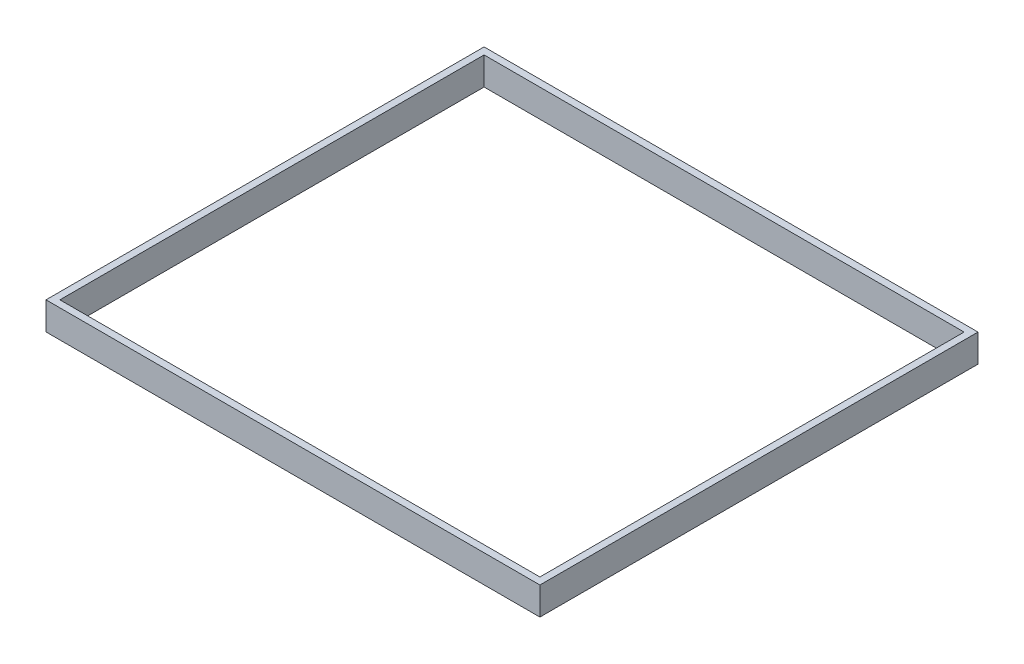
ISO-10303-21;
HEADER;
FILE_DESCRIPTION(('STEP AP214'),'2;1');
FILE_NAME('part.step','',(''),(''),'','','');
FILE_SCHEMA(('AUTOMOTIVE_DESIGN { 1 0 10303 214 1 1 1 1 }'));
ENDSEC;
DATA;
#1=APPLICATION_CONTEXT('core data for automotive mechanical design processes');
#2=APPLICATION_PROTOCOL_DEFINITION('international standard','automotive_design',2000,#1);
#3=PRODUCT_CONTEXT('',#1,'mechanical');
#4=PRODUCT('Part','Part','',(#3));
#5=PRODUCT_RELATED_PRODUCT_CATEGORY('part','',(#4));
#6=PRODUCT_DEFINITION_FORMATION('','',#4);
#7=PRODUCT_DEFINITION_CONTEXT('part definition',#1,'design');
#8=PRODUCT_DEFINITION('design','',#6,#7);
#9=PRODUCT_DEFINITION_SHAPE('','',#8);
#10=(LENGTH_UNIT() NAMED_UNIT(*) SI_UNIT(.MILLI.,.METRE.));
#11=(NAMED_UNIT(*) PLANE_ANGLE_UNIT() SI_UNIT($,.RADIAN.));
#12=(NAMED_UNIT(*) SI_UNIT($,.STERADIAN.) SOLID_ANGLE_UNIT());
#13=UNCERTAINTY_MEASURE_WITH_UNIT(LENGTH_MEASURE(1.E-05),#10,'distance_accuracy_value','');
#14=(GEOMETRIC_REPRESENTATION_CONTEXT(3) GLOBAL_UNCERTAINTY_ASSIGNED_CONTEXT((#13)) GLOBAL_UNIT_ASSIGNED_CONTEXT((#10,
#11,#12)) REPRESENTATION_CONTEXT('',''));
#15=CARTESIAN_POINT('',(0.,0.,0.));
#16=DIRECTION('',(0.,0.,1.));
#17=DIRECTION('',(1.,0.,0.));
#18=AXIS2_PLACEMENT_3D('',#15,#16,#17);
#19=CARTESIAN_POINT('',(0.,16.,0.));
#20=DIRECTION('',(0.,1.,0.));
#21=DIRECTION('',(0.,0.,1.));
#22=AXIS2_PLACEMENT_3D('',#19,#20,#21);
#23=PLANE('',#22);
#24=DIRECTION('',(0.,0.,-1.));
#25=VECTOR('',#24,1.);
#26=CARTESIAN_POINT('',(142.037025909781,16.,-121.986208943527));
#27=LINE('',#26,#25);
#28=CARTESIAN_POINT('',(142.037025909781,16.,125.986208943527));
#29=VERTEX_POINT('',#28);
#30=CARTESIAN_POINT('',(142.037025909781,16.,-125.986208943527));
#31=VERTEX_POINT('',#30);
#32=EDGE_CURVE('E170',#29,#31,#27,.T.);
#33=ORIENTED_EDGE('',*,*,#32,.T.);
#34=DIRECTION('',(-1.,0.,0.));
#35=VECTOR('',#34,1.);
#36=CARTESIAN_POINT('',(-138.037025909781,16.,-125.986208943527));
#37=LINE('',#36,#35);
#38=CARTESIAN_POINT('',(-142.037025909781,16.,-125.986208943527));
#39=VERTEX_POINT('',#38);
#40=EDGE_CURVE('E173',#31,#39,#37,.T.);
#41=ORIENTED_EDGE('',*,*,#40,.T.);
#42=DIRECTION('',(0.,0.,1.));
#43=VECTOR('',#42,1.);
#44=CARTESIAN_POINT('',(-142.037025909781,16.,-121.986208943527));
#45=LINE('',#44,#43);
#46=CARTESIAN_POINT('',(-142.037025909781,16.,125.986208943527));
#47=VERTEX_POINT('',#46);
#48=EDGE_CURVE('E176',#39,#47,#45,.T.);
#49=ORIENTED_EDGE('',*,*,#48,.T.);
#50=DIRECTION('',(1.,0.,0.));
#51=VECTOR('',#50,1.);
#52=CARTESIAN_POINT('',(-138.037025909781,16.,125.986208943527));
#53=LINE('',#52,#51);
#54=EDGE_CURVE('E178',#47,#29,#53,.T.);
#55=ORIENTED_EDGE('',*,*,#54,.T.);
#56=EDGE_LOOP('',(#33,#41,#49,#55));
#57=FACE_BOUND('',#56,.T.);
#58=DIRECTION('',(-1.,0.,0.));
#59=VECTOR('',#58,1.);
#60=CARTESIAN_POINT('',(-138.037025909781,16.,-121.986208943527));
#61=LINE('',#60,#59);
#62=CARTESIAN_POINT('',(138.037025909781,16.,-121.986208943527));
#63=VERTEX_POINT('',#62);
#64=CARTESIAN_POINT('',(-138.037025909781,16.,-121.986208943527));
#65=VERTEX_POINT('',#64);
#66=EDGE_CURVE('E142',#63,#65,#61,.T.);
#67=ORIENTED_EDGE('',*,*,#66,.F.);
#68=DIRECTION('',(0.,0.,-1.));
#69=VECTOR('',#68,1.);
#70=CARTESIAN_POINT('',(138.037025909781,16.,-121.986208943527));
#71=LINE('',#70,#69);
#72=CARTESIAN_POINT('',(138.037025909781,16.,121.986208943527));
#73=VERTEX_POINT('',#72);
#74=EDGE_CURVE('E134',#73,#63,#71,.T.);
#75=ORIENTED_EDGE('',*,*,#74,.F.);
#76=DIRECTION('',(1.,0.,0.));
#77=VECTOR('',#76,1.);
#78=CARTESIAN_POINT('',(-138.037025909781,16.,121.986208943527));
#79=LINE('',#78,#77);
#80=CARTESIAN_POINT('',(-138.037025909781,16.,121.986208943527));
#81=VERTEX_POINT('',#80);
#82=EDGE_CURVE('E156',#81,#73,#79,.T.);
#83=ORIENTED_EDGE('',*,*,#82,.F.);
#84=DIRECTION('',(0.,0.,1.));
#85=VECTOR('',#84,1.);
#86=CARTESIAN_POINT('',(-138.037025909781,16.,-121.986208943527));
#87=LINE('',#86,#85);
#88=EDGE_CURVE('E154',#65,#81,#87,.T.);
#89=ORIENTED_EDGE('',*,*,#88,.F.);
#90=EDGE_LOOP('',(#67,#75,#83,#89));
#91=FACE_BOUND('',#90,.T.);
#92=ADVANCED_FACE('F69',(#57,#91),#23,.T.);
#93=CARTESIAN_POINT('',(0.,0.,0.));
#94=DIRECTION('',(0.,1.,0.));
#95=DIRECTION('',(0.,0.,1.));
#96=AXIS2_PLACEMENT_3D('',#93,#94,#95);
#97=PLANE('',#96);
#98=DIRECTION('',(0.,0.,-1.));
#99=VECTOR('',#98,1.);
#100=CARTESIAN_POINT('',(142.037025909781,0.,-121.986208943527));
#101=LINE('',#100,#99);
#102=CARTESIAN_POINT('',(142.037025909781,0.,125.986208943527));
#103=VERTEX_POINT('',#102);
#104=CARTESIAN_POINT('',(142.037025909781,0.,-125.986208943527));
#105=VERTEX_POINT('',#104);
#106=EDGE_CURVE('E150',#103,#105,#101,.T.);
#107=ORIENTED_EDGE('',*,*,#106,.F.);
#108=DIRECTION('',(1.,0.,0.));
#109=VECTOR('',#108,1.);
#110=CARTESIAN_POINT('',(-138.037025909781,0.,125.986208943527));
#111=LINE('',#110,#109);
#112=CARTESIAN_POINT('',(-142.037025909781,0.,125.986208943527));
#113=VERTEX_POINT('',#112);
#114=EDGE_CURVE('E174',#113,#103,#111,.T.);
#115=ORIENTED_EDGE('',*,*,#114,.F.);
#116=DIRECTION('',(0.,0.,1.));
#117=VECTOR('',#116,1.);
#118=CARTESIAN_POINT('',(-142.037025909781,0.,-121.986208943527));
#119=LINE('',#118,#117);
#120=CARTESIAN_POINT('',(-142.037025909781,0.,-125.986208943527));
#121=VERTEX_POINT('',#120);
#122=EDGE_CURVE('E185',#121,#113,#119,.T.);
#123=ORIENTED_EDGE('',*,*,#122,.F.);
#124=DIRECTION('',(-1.,0.,0.));
#125=VECTOR('',#124,1.);
#126=CARTESIAN_POINT('',(-138.037025909781,0.,-125.986208943527));
#127=LINE('',#126,#125);
#128=EDGE_CURVE('E183',#105,#121,#127,.T.);
#129=ORIENTED_EDGE('',*,*,#128,.F.);
#130=EDGE_LOOP('',(#107,#115,#123,#129));
#131=FACE_BOUND('',#130,.T.);
#132=DIRECTION('',(0.,0.,-1.));
#133=VECTOR('',#132,1.);
#134=CARTESIAN_POINT('',(138.037025909781,0.,-121.986208943527));
#135=LINE('',#134,#133);
#136=CARTESIAN_POINT('',(138.037025909781,0.,121.986208943527));
#137=VERTEX_POINT('',#136);
#138=CARTESIAN_POINT('',(138.037025909781,0.,-121.986208943527));
#139=VERTEX_POINT('',#138);
#140=EDGE_CURVE('E92',#137,#139,#135,.T.);
#141=ORIENTED_EDGE('',*,*,#140,.T.);
#142=DIRECTION('',(-1.,0.,0.));
#143=VECTOR('',#142,1.);
#144=CARTESIAN_POINT('',(-138.037025909781,0.,-121.986208943527));
#145=LINE('',#144,#143);
#146=CARTESIAN_POINT('',(-138.037025909781,0.,-121.986208943527));
#147=VERTEX_POINT('',#146);
#148=EDGE_CURVE('E149',#139,#147,#145,.T.);
#149=ORIENTED_EDGE('',*,*,#148,.T.);
#150=DIRECTION('',(0.,0.,1.));
#151=VECTOR('',#150,1.);
#152=CARTESIAN_POINT('',(-138.037025909781,0.,-121.986208943527));
#153=LINE('',#152,#151);
#154=CARTESIAN_POINT('',(-138.037025909781,0.,121.986208943527));
#155=VERTEX_POINT('',#154);
#156=EDGE_CURVE('E162',#147,#155,#153,.T.);
#157=ORIENTED_EDGE('',*,*,#156,.T.);
#158=DIRECTION('',(1.,0.,0.));
#159=VECTOR('',#158,1.);
#160=CARTESIAN_POINT('',(-138.037025909781,0.,121.986208943527));
#161=LINE('',#160,#159);
#162=EDGE_CURVE('E143',#155,#137,#161,.T.);
#163=ORIENTED_EDGE('',*,*,#162,.T.);
#164=EDGE_LOOP('',(#141,#149,#157,#163));
#165=FACE_BOUND('',#164,.T.);
#166=ADVANCED_FACE('F203',(#131,#165),#97,.F.);
#167=CARTESIAN_POINT('',(142.037025909781,16.,-121.986208943527));
#168=DIRECTION('',(-1.,0.,0.));
#169=DIRECTION('',(0.,0.,1.));
#170=AXIS2_PLACEMENT_3D('',#167,#168,#169);
#171=PLANE('',#170);
#172=ORIENTED_EDGE('',*,*,#106,.T.);
#173=DIRECTION('',(0.,-1.,0.));
#174=VECTOR('',#173,1.);
#175=CARTESIAN_POINT('',(142.037025909781,16.,-125.986208943527));
#176=LINE('',#175,#174);
#177=EDGE_CURVE('E12',#31,#105,#176,.T.);
#178=ORIENTED_EDGE('',*,*,#177,.F.);
#179=ORIENTED_EDGE('',*,*,#32,.F.);
#180=DIRECTION('',(0.,-1.,0.));
#181=VECTOR('',#180,1.);
#182=CARTESIAN_POINT('',(142.037025909781,16.,125.986208943527));
#183=LINE('',#182,#181);
#184=EDGE_CURVE('E180',#29,#103,#183,.T.);
#185=ORIENTED_EDGE('',*,*,#184,.T.);
#186=EDGE_LOOP('',(#172,#178,#179,#185));
#187=FACE_BOUND('',#186,.T.);
#188=ADVANCED_FACE('F71',(#187),#171,.F.);
#189=CARTESIAN_POINT('',(-138.037025909781,16.,-125.986208943527));
#190=DIRECTION('',(0.,0.,1.));
#191=DIRECTION('',(1.,0.,0.));
#192=AXIS2_PLACEMENT_3D('',#189,#190,#191);
#193=PLANE('',#192);
#194=ORIENTED_EDGE('',*,*,#128,.T.);
#195=DIRECTION('',(0.,-1.,0.));
#196=VECTOR('',#195,1.);
#197=CARTESIAN_POINT('',(-142.037025909781,16.,-125.986208943527));
#198=LINE('',#197,#196);
#199=EDGE_CURVE('E77',#39,#121,#198,.T.);
#200=ORIENTED_EDGE('',*,*,#199,.F.);
#201=ORIENTED_EDGE('',*,*,#40,.F.);
#202=ORIENTED_EDGE('',*,*,#177,.T.);
#203=EDGE_LOOP('',(#194,#200,#201,#202));
#204=FACE_BOUND('',#203,.T.);
#205=ADVANCED_FACE('F213',(#204),#193,.F.);
#206=CARTESIAN_POINT('',(-142.037025909781,16.,-121.986208943527));
#207=DIRECTION('',(1.,0.,0.));
#208=DIRECTION('',(0.,0.,-1.));
#209=AXIS2_PLACEMENT_3D('',#206,#207,#208);
#210=PLANE('',#209);
#211=ORIENTED_EDGE('',*,*,#122,.T.);
#212=DIRECTION('',(0.,-1.,0.));
#213=VECTOR('',#212,1.);
#214=CARTESIAN_POINT('',(-142.037025909781,16.,125.986208943527));
#215=LINE('',#214,#213);
#216=EDGE_CURVE('E190',#47,#113,#215,.T.);
#217=ORIENTED_EDGE('',*,*,#216,.F.);
#218=ORIENTED_EDGE('',*,*,#48,.F.);
#219=ORIENTED_EDGE('',*,*,#199,.T.);
#220=EDGE_LOOP('',(#211,#217,#218,#219));
#221=FACE_BOUND('',#220,.T.);
#222=ADVANCED_FACE('F197',(#221),#210,.F.);
#223=CARTESIAN_POINT('',(-138.037025909781,16.,125.986208943527));
#224=DIRECTION('',(0.,0.,-1.));
#225=DIRECTION('',(-1.,0.,0.));
#226=AXIS2_PLACEMENT_3D('',#223,#224,#225);
#227=PLANE('',#226);
#228=ORIENTED_EDGE('',*,*,#114,.T.);
#229=ORIENTED_EDGE('',*,*,#184,.F.);
#230=ORIENTED_EDGE('',*,*,#54,.F.);
#231=ORIENTED_EDGE('',*,*,#216,.T.);
#232=EDGE_LOOP('',(#228,#229,#230,#231));
#233=FACE_BOUND('',#232,.T.);
#234=ADVANCED_FACE('F207',(#233),#227,.F.);
#235=CARTESIAN_POINT('',(138.037025909781,16.,-121.986208943527));
#236=DIRECTION('',(-1.,0.,0.));
#237=DIRECTION('',(0.,0.,1.));
#238=AXIS2_PLACEMENT_3D('',#235,#236,#237);
#239=PLANE('',#238);
#240=ORIENTED_EDGE('',*,*,#140,.F.);
#241=DIRECTION('',(0.,-1.,0.));
#242=VECTOR('',#241,1.);
#243=CARTESIAN_POINT('',(138.037025909781,16.,121.986208943527));
#244=LINE('',#243,#242);
#245=EDGE_CURVE('E138',#73,#137,#244,.T.);
#246=ORIENTED_EDGE('',*,*,#245,.F.);
#247=ORIENTED_EDGE('',*,*,#74,.T.);
#248=DIRECTION('',(0.,-1.,0.));
#249=VECTOR('',#248,1.);
#250=CARTESIAN_POINT('',(138.037025909781,16.,-121.986208943527));
#251=LINE('',#250,#249);
#252=EDGE_CURVE('E137',#63,#139,#251,.T.);
#253=ORIENTED_EDGE('',*,*,#252,.T.);
#254=EDGE_LOOP('',(#240,#246,#247,#253));
#255=FACE_BOUND('',#254,.T.);
#256=ADVANCED_FACE('F136',(#255),#239,.T.);
#257=CARTESIAN_POINT('',(-138.037025909781,16.,-121.986208943527));
#258=DIRECTION('',(0.,0.,1.));
#259=DIRECTION('',(1.,0.,0.));
#260=AXIS2_PLACEMENT_3D('',#257,#258,#259);
#261=PLANE('',#260);
#262=ORIENTED_EDGE('',*,*,#148,.F.);
#263=ORIENTED_EDGE('',*,*,#252,.F.);
#264=ORIENTED_EDGE('',*,*,#66,.T.);
#265=DIRECTION('',(0.,-1.,0.));
#266=VECTOR('',#265,1.);
#267=CARTESIAN_POINT('',(-138.037025909781,16.,-121.986208943527));
#268=LINE('',#267,#266);
#269=EDGE_CURVE('E151',#65,#147,#268,.T.);
#270=ORIENTED_EDGE('',*,*,#269,.T.);
#271=EDGE_LOOP('',(#262,#263,#264,#270));
#272=FACE_BOUND('',#271,.T.);
#273=ADVANCED_FACE('F146',(#272),#261,.T.);
#274=CARTESIAN_POINT('',(-138.037025909781,16.,-121.986208943527));
#275=DIRECTION('',(1.,0.,0.));
#276=DIRECTION('',(0.,0.,-1.));
#277=AXIS2_PLACEMENT_3D('',#274,#275,#276);
#278=PLANE('',#277);
#279=ORIENTED_EDGE('',*,*,#156,.F.);
#280=ORIENTED_EDGE('',*,*,#269,.F.);
#281=ORIENTED_EDGE('',*,*,#88,.T.);
#282=DIRECTION('',(0.,-1.,0.));
#283=VECTOR('',#282,1.);
#284=CARTESIAN_POINT('',(-138.037025909781,16.,121.986208943527));
#285=LINE('',#284,#283);
#286=EDGE_CURVE('E84',#81,#155,#285,.T.);
#287=ORIENTED_EDGE('',*,*,#286,.T.);
#288=EDGE_LOOP('',(#279,#280,#281,#287));
#289=FACE_BOUND('',#288,.T.);
#290=ADVANCED_FACE('F237',(#289),#278,.T.);
#291=CARTESIAN_POINT('',(-138.037025909781,16.,121.986208943527));
#292=DIRECTION('',(0.,0.,-1.));
#293=DIRECTION('',(-1.,0.,0.));
#294=AXIS2_PLACEMENT_3D('',#291,#292,#293);
#295=PLANE('',#294);
#296=ORIENTED_EDGE('',*,*,#162,.F.);
#297=ORIENTED_EDGE('',*,*,#286,.F.);
#298=ORIENTED_EDGE('',*,*,#82,.T.);
#299=ORIENTED_EDGE('',*,*,#245,.T.);
#300=EDGE_LOOP('',(#296,#297,#298,#299));
#301=FACE_BOUND('',#300,.T.);
#302=ADVANCED_FACE('F241',(#301),#295,.T.);
#303=CLOSED_SHELL('',(#92,#166,#188,#205,#222,#234,#256,#273,#290,#302));
#304=MANIFOLD_SOLID_BREP('B2',#303);
#305=ADVANCED_BREP_SHAPE_REPRESENTATION('',(#18,#304),#14);
#306=SHAPE_DEFINITION_REPRESENTATION(#9,#305);
ENDSEC;
END-ISO-10303-21;
